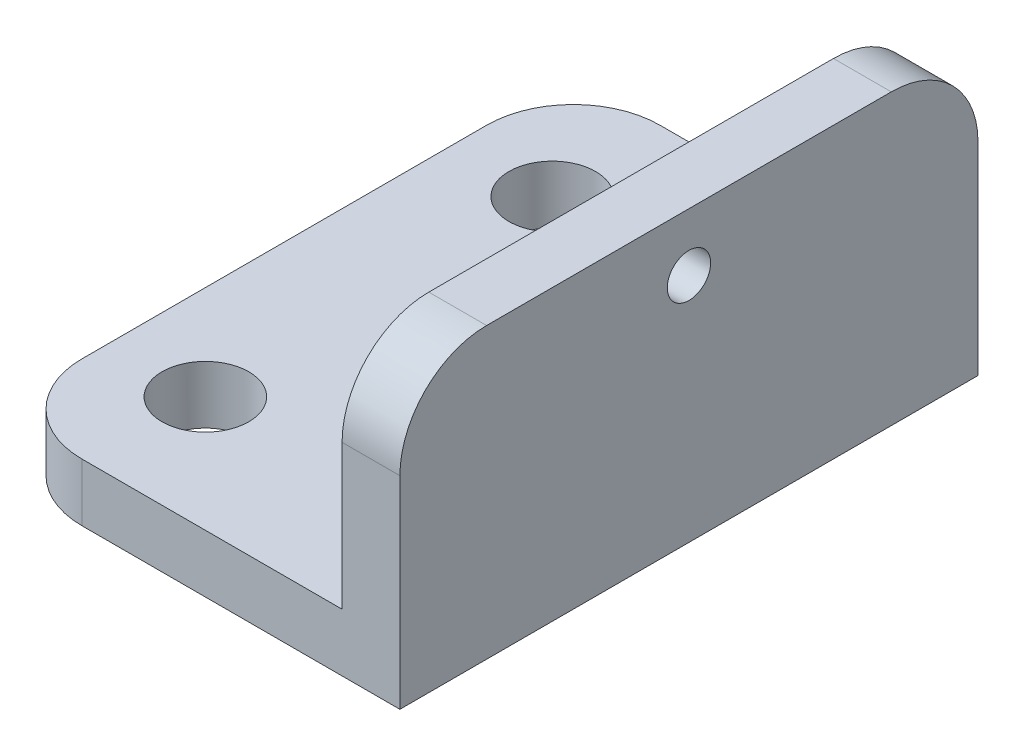
ISO-10303-21;
HEADER;
FILE_DESCRIPTION(('STEP AP214'),'2;1');
FILE_NAME('part.step','',(''),(''),'','','');
FILE_SCHEMA(('AUTOMOTIVE_DESIGN { 1 0 10303 214 1 1 1 1 }'));
ENDSEC;
DATA;
#1=APPLICATION_CONTEXT('core data for automotive mechanical design processes');
#2=APPLICATION_PROTOCOL_DEFINITION('international standard','automotive_design',2000,#1);
#3=PRODUCT_CONTEXT('',#1,'mechanical');
#4=PRODUCT('Part','Part','',(#3));
#5=PRODUCT_RELATED_PRODUCT_CATEGORY('part','',(#4));
#6=PRODUCT_DEFINITION_FORMATION('','',#4);
#7=PRODUCT_DEFINITION_CONTEXT('part definition',#1,'design');
#8=PRODUCT_DEFINITION('design','',#6,#7);
#9=PRODUCT_DEFINITION_SHAPE('','',#8);
#10=(LENGTH_UNIT() NAMED_UNIT(*) SI_UNIT(.MILLI.,.METRE.));
#11=(NAMED_UNIT(*) PLANE_ANGLE_UNIT() SI_UNIT($,.RADIAN.));
#12=(NAMED_UNIT(*) SI_UNIT($,.STERADIAN.) SOLID_ANGLE_UNIT());
#13=UNCERTAINTY_MEASURE_WITH_UNIT(LENGTH_MEASURE(1.E-05),#10,'distance_accuracy_value','');
#14=(GEOMETRIC_REPRESENTATION_CONTEXT(3) GLOBAL_UNCERTAINTY_ASSIGNED_CONTEXT((#13)) GLOBAL_UNIT_ASSIGNED_CONTEXT((#10,
#11,#12)) REPRESENTATION_CONTEXT('',''));
#15=CARTESIAN_POINT('',(0.,0.,0.));
#16=DIRECTION('',(0.,0.,1.));
#17=DIRECTION('',(1.,0.,0.));
#18=AXIS2_PLACEMENT_3D('',#15,#16,#17);
#19=CARTESIAN_POINT('',(2.,0.,10.));
#20=DIRECTION('',(-1.,0.,0.));
#21=DIRECTION('',(0.,0.,1.));
#22=AXIS2_PLACEMENT_3D('',#19,#20,#21);
#23=PLANE('',#22);
#24=CARTESIAN_POINT('',(2.,6.,0.));
#25=DIRECTION('',(-1.,0.,0.));
#26=DIRECTION('',(0.,0.,1.));
#27=AXIS2_PLACEMENT_3D('',#24,#25,#26);
#28=CIRCLE('',#27,0.75);
#29=CARTESIAN_POINT('',(2.,6.,0.75));
#30=VERTEX_POINT('',#29);
#31=EDGE_CURVE('E204',#30,#30,#28,.T.);
#32=ORIENTED_EDGE('',*,*,#31,.T.);
#33=EDGE_LOOP('',(#32));
#34=FACE_BOUND('',#33,.T.);
#35=DIRECTION('',(0.,0.,-1.));
#36=VECTOR('',#35,1.);
#37=CARTESIAN_POINT('',(2.,8.,10.));
#38=LINE('',#37,#36);
#39=CARTESIAN_POINT('',(2.,8.,7.));
#40=VERTEX_POINT('',#39);
#41=CARTESIAN_POINT('',(2.,8.,-7.));
#42=VERTEX_POINT('',#41);
#43=EDGE_CURVE('E160',#40,#42,#38,.T.);
#44=ORIENTED_EDGE('',*,*,#43,.F.);
#45=CARTESIAN_POINT('',(2.,5.,7.));
#46=DIRECTION('',(-1.,0.,0.));
#47=DIRECTION('',(0.,0.,1.));
#48=AXIS2_PLACEMENT_3D('',#45,#46,#47);
#49=CIRCLE('',#48,3.);
#50=CARTESIAN_POINT('',(2.,5.,10.));
#51=VERTEX_POINT('',#50);
#52=EDGE_CURVE('E170',#40,#51,#49,.F.);
#53=ORIENTED_EDGE('',*,*,#52,.T.);
#54=DIRECTION('',(0.,1.,0.));
#55=VECTOR('',#54,1.);
#56=CARTESIAN_POINT('',(2.,0.,10.));
#57=LINE('',#56,#55);
#58=CARTESIAN_POINT('',(2.,-2.,10.));
#59=VERTEX_POINT('',#58);
#60=EDGE_CURVE('E138',#59,#51,#57,.T.);
#61=ORIENTED_EDGE('',*,*,#60,.F.);
#62=DIRECTION('',(0.,0.,-1.));
#63=VECTOR('',#62,1.);
#64=CARTESIAN_POINT('',(2.,-2.,10.));
#65=LINE('',#64,#63);
#66=CARTESIAN_POINT('',(2.,-2.,-10.));
#67=VERTEX_POINT('',#66);
#68=EDGE_CURVE('E145',#59,#67,#65,.T.);
#69=ORIENTED_EDGE('',*,*,#68,.T.);
#70=DIRECTION('',(0.,1.,0.));
#71=VECTOR('',#70,1.);
#72=CARTESIAN_POINT('',(2.,0.,-10.));
#73=LINE('',#72,#71);
#74=CARTESIAN_POINT('',(2.,5.,-10.));
#75=VERTEX_POINT('',#74);
#76=EDGE_CURVE('E146',#67,#75,#73,.T.);
#77=ORIENTED_EDGE('',*,*,#76,.T.);
#78=CARTESIAN_POINT('',(2.,5.,-7.));
#79=DIRECTION('',(-1.,0.,0.));
#80=DIRECTION('',(0.,0.,1.));
#81=AXIS2_PLACEMENT_3D('',#78,#79,#80);
#82=CIRCLE('',#81,3.);
#83=EDGE_CURVE('E168',#75,#42,#82,.F.);
#84=ORIENTED_EDGE('',*,*,#83,.T.);
#85=EDGE_LOOP('',(#44,#53,#61,#69,#77,#84));
#86=FACE_BOUND('',#85,.T.);
#87=ADVANCED_FACE('F32',(#34,#86),#23,.F.);
#88=CARTESIAN_POINT('',(0.,8.,10.));
#89=DIRECTION('',(0.,1.,0.));
#90=DIRECTION('',(0.,0.,1.));
#91=AXIS2_PLACEMENT_3D('',#88,#89,#90);
#92=PLANE('',#91);
#93=DIRECTION('',(0.,0.,-1.));
#94=VECTOR('',#93,1.);
#95=CARTESIAN_POINT('',(0.,8.,10.));
#96=LINE('',#95,#94);
#97=CARTESIAN_POINT('',(0.,8.,7.));
#98=VERTEX_POINT('',#97);
#99=CARTESIAN_POINT('',(0.,8.,-7.));
#100=VERTEX_POINT('',#99);
#101=EDGE_CURVE('E131',#98,#100,#96,.T.);
#102=ORIENTED_EDGE('',*,*,#101,.F.);
#103=DIRECTION('',(1.,0.,0.));
#104=VECTOR('',#103,1.);
#105=CARTESIAN_POINT('',(2.,8.,7.));
#106=LINE('',#105,#104);
#107=EDGE_CURVE('E165',#98,#40,#106,.T.);
#108=ORIENTED_EDGE('',*,*,#107,.T.);
#109=ORIENTED_EDGE('',*,*,#43,.T.);
#110=DIRECTION('',(1.,0.,0.));
#111=VECTOR('',#110,1.);
#112=CARTESIAN_POINT('',(0.,8.,-7.));
#113=LINE('',#112,#111);
#114=EDGE_CURVE('E163',#42,#100,#113,.F.);
#115=ORIENTED_EDGE('',*,*,#114,.T.);
#116=EDGE_LOOP('',(#102,#108,#109,#115));
#117=FACE_BOUND('',#116,.T.);
#118=ADVANCED_FACE('F216',(#117),#92,.T.);
#119=CARTESIAN_POINT('',(0.,0.,10.));
#120=DIRECTION('',(-1.,0.,0.));
#121=DIRECTION('',(0.,0.,1.));
#122=AXIS2_PLACEMENT_3D('',#119,#120,#121);
#123=PLANE('',#122);
#124=CARTESIAN_POINT('',(0.,6.,0.));
#125=DIRECTION('',(-1.,0.,0.));
#126=DIRECTION('',(0.,0.,1.));
#127=AXIS2_PLACEMENT_3D('',#124,#125,#126);
#128=CIRCLE('',#127,0.75);
#129=CARTESIAN_POINT('',(0.,6.,0.75));
#130=VERTEX_POINT('',#129);
#131=EDGE_CURVE('E208',#130,#130,#128,.T.);
#132=ORIENTED_EDGE('',*,*,#131,.F.);
#133=EDGE_LOOP('',(#132));
#134=FACE_BOUND('',#133,.T.);
#135=DIRECTION('',(0.,1.,0.));
#136=VECTOR('',#135,1.);
#137=CARTESIAN_POINT('',(0.,0.,10.));
#138=LINE('',#137,#136);
#139=CARTESIAN_POINT('',(0.,0.,10.));
#140=VERTEX_POINT('',#139);
#141=CARTESIAN_POINT('',(0.,5.,10.));
#142=VERTEX_POINT('',#141);
#143=EDGE_CURVE('E123',#140,#142,#138,.T.);
#144=ORIENTED_EDGE('',*,*,#143,.T.);
#145=CARTESIAN_POINT('',(0.,5.,7.));
#146=DIRECTION('',(-1.,0.,0.));
#147=DIRECTION('',(0.,0.,1.));
#148=AXIS2_PLACEMENT_3D('',#145,#146,#147);
#149=CIRCLE('',#148,3.);
#150=EDGE_CURVE('E177',#142,#98,#149,.T.);
#151=ORIENTED_EDGE('',*,*,#150,.T.);
#152=ORIENTED_EDGE('',*,*,#101,.T.);
#153=CARTESIAN_POINT('',(0.,5.,-7.));
#154=DIRECTION('',(-1.,0.,0.));
#155=DIRECTION('',(0.,0.,1.));
#156=AXIS2_PLACEMENT_3D('',#153,#154,#155);
#157=CIRCLE('',#156,3.);
#158=CARTESIAN_POINT('',(0.,5.,-10.));
#159=VERTEX_POINT('',#158);
#160=EDGE_CURVE('E175',#100,#159,#157,.T.);
#161=ORIENTED_EDGE('',*,*,#160,.T.);
#162=DIRECTION('',(0.,1.,0.));
#163=VECTOR('',#162,1.);
#164=CARTESIAN_POINT('',(0.,0.,-10.));
#165=LINE('',#164,#163);
#166=CARTESIAN_POINT('',(0.,0.,-10.));
#167=VERTEX_POINT('',#166);
#168=EDGE_CURVE('E130',#167,#159,#165,.T.);
#169=ORIENTED_EDGE('',*,*,#168,.F.);
#170=DIRECTION('',(0.,0.,-1.));
#171=VECTOR('',#170,1.);
#172=CARTESIAN_POINT('',(0.,0.,10.));
#173=LINE('',#172,#171);
#174=EDGE_CURVE('E115',#140,#167,#173,.T.);
#175=ORIENTED_EDGE('',*,*,#174,.F.);
#176=EDGE_LOOP('',(#144,#151,#152,#161,#169,#175));
#177=FACE_BOUND('',#176,.T.);
#178=ADVANCED_FACE('F127',(#134,#177),#123,.T.);
#179=CARTESIAN_POINT('',(0.,0.,10.));
#180=DIRECTION('',(0.,1.,0.));
#181=DIRECTION('',(-1.,0.,0.));
#182=AXIS2_PLACEMENT_3D('',#179,#180,#181);
#183=PLANE('',#182);
#184=CARTESIAN_POINT('',(-8.729026118516,0.,-6.));
#185=DIRECTION('',(0.,1.,0.));
#186=DIRECTION('',(-1.,0.,0.));
#187=AXIS2_PLACEMENT_3D('',#184,#185,#186);
#188=CIRCLE('',#187,1.5);
#189=CARTESIAN_POINT('',(-10.229026118516,0.,-6.));
#190=VERTEX_POINT('',#189);
#191=EDGE_CURVE('E194',#190,#190,#188,.T.);
#192=ORIENTED_EDGE('',*,*,#191,.F.);
#193=EDGE_LOOP('',(#192));
#194=FACE_BOUND('',#193,.T.);
#195=CARTESIAN_POINT('',(-8.729026118516,0.,6.));
#196=DIRECTION('',(0.,1.,0.));
#197=DIRECTION('',(1.,0.,0.));
#198=AXIS2_PLACEMENT_3D('',#195,#196,#197);
#199=CIRCLE('',#198,1.5);
#200=CARTESIAN_POINT('',(-7.22902611851601,0.,6.));
#201=VERTEX_POINT('',#200);
#202=EDGE_CURVE('E199',#201,#201,#199,.T.);
#203=ORIENTED_EDGE('',*,*,#202,.F.);
#204=EDGE_LOOP('',(#203));
#205=FACE_BOUND('',#204,.T.);
#206=DIRECTION('',(1.,0.,0.));
#207=VECTOR('',#206,1.);
#208=CARTESIAN_POINT('',(0.,0.,-10.));
#209=LINE('',#208,#207);
#210=CARTESIAN_POINT('',(-9.,0.,-10.));
#211=VERTEX_POINT('',#210);
#212=EDGE_CURVE('E150',#211,#167,#209,.T.);
#213=ORIENTED_EDGE('',*,*,#212,.F.);
#214=CARTESIAN_POINT('',(-9.,0.,-7.));
#215=DIRECTION('',(0.,1.,0.));
#216=DIRECTION('',(-1.,0.,0.));
#217=AXIS2_PLACEMENT_3D('',#214,#215,#216);
#218=CIRCLE('',#217,3.);
#219=CARTESIAN_POINT('',(-12.,0.,-7.));
#220=VERTEX_POINT('',#219);
#221=EDGE_CURVE('E186',#211,#220,#218,.T.);
#222=ORIENTED_EDGE('',*,*,#221,.T.);
#223=DIRECTION('',(0.,0.,-1.));
#224=VECTOR('',#223,1.);
#225=CARTESIAN_POINT('',(-12.,0.,10.));
#226=LINE('',#225,#224);
#227=CARTESIAN_POINT('',(-12.,0.,7.));
#228=VERTEX_POINT('',#227);
#229=EDGE_CURVE('E132',#228,#220,#226,.T.);
#230=ORIENTED_EDGE('',*,*,#229,.F.);
#231=CARTESIAN_POINT('',(-9.,0.,7.));
#232=DIRECTION('',(0.,1.,0.));
#233=DIRECTION('',(-1.,0.,0.));
#234=AXIS2_PLACEMENT_3D('',#231,#232,#233);
#235=CIRCLE('',#234,3.);
#236=CARTESIAN_POINT('',(-9.,0.,10.));
#237=VERTEX_POINT('',#236);
#238=EDGE_CURVE('E118',#228,#237,#235,.T.);
#239=ORIENTED_EDGE('',*,*,#238,.T.);
#240=DIRECTION('',(1.,0.,0.));
#241=VECTOR('',#240,1.);
#242=CARTESIAN_POINT('',(0.,0.,10.));
#243=LINE('',#242,#241);
#244=EDGE_CURVE('E111',#237,#140,#243,.T.);
#245=ORIENTED_EDGE('',*,*,#244,.T.);
#246=ORIENTED_EDGE('',*,*,#174,.T.);
#247=EDGE_LOOP('',(#213,#222,#230,#239,#245,#246));
#248=FACE_BOUND('',#247,.T.);
#249=ADVANCED_FACE('F114',(#194,#205,#248),#183,.T.);
#250=CARTESIAN_POINT('',(-12.,-2.,10.));
#251=DIRECTION('',(-1.,0.,0.));
#252=DIRECTION('',(0.,0.,1.));
#253=AXIS2_PLACEMENT_3D('',#250,#251,#252);
#254=PLANE('',#253);
#255=ORIENTED_EDGE('',*,*,#229,.T.);
#256=DIRECTION('',(0.,1.,0.));
#257=VECTOR('',#256,1.);
#258=CARTESIAN_POINT('',(-12.,-2.,-7.));
#259=LINE('',#258,#257);
#260=CARTESIAN_POINT('',(-12.,-2.,-7.));
#261=VERTEX_POINT('',#260);
#262=EDGE_CURVE('E49',#220,#261,#259,.F.);
#263=ORIENTED_EDGE('',*,*,#262,.T.);
#264=DIRECTION('',(0.,0.,-1.));
#265=VECTOR('',#264,1.);
#266=CARTESIAN_POINT('',(-12.,-2.,10.));
#267=LINE('',#266,#265);
#268=CARTESIAN_POINT('',(-12.,-2.,7.));
#269=VERTEX_POINT('',#268);
#270=EDGE_CURVE('E155',#269,#261,#267,.T.);
#271=ORIENTED_EDGE('',*,*,#270,.F.);
#272=DIRECTION('',(0.,1.,0.));
#273=VECTOR('',#272,1.);
#274=CARTESIAN_POINT('',(-12.,0.,7.));
#275=LINE('',#274,#273);
#276=EDGE_CURVE('E188',#269,#228,#275,.T.);
#277=ORIENTED_EDGE('',*,*,#276,.T.);
#278=EDGE_LOOP('',(#255,#263,#271,#277));
#279=FACE_BOUND('',#278,.T.);
#280=ADVANCED_FACE('F222',(#279),#254,.T.);
#281=CARTESIAN_POINT('',(0.,-2.,10.));
#282=DIRECTION('',(0.,1.,0.));
#283=DIRECTION('',(-1.,0.,0.));
#284=AXIS2_PLACEMENT_3D('',#281,#282,#283);
#285=PLANE('',#284);
#286=CARTESIAN_POINT('',(-8.729026118516,-2.,-6.));
#287=DIRECTION('',(0.,1.,0.));
#288=DIRECTION('',(-1.,0.,0.));
#289=AXIS2_PLACEMENT_3D('',#286,#287,#288);
#290=CIRCLE('',#289,1.5);
#291=CARTESIAN_POINT('',(-10.229026118516,-2.,-6.));
#292=VERTEX_POINT('',#291);
#293=EDGE_CURVE('E36',#292,#292,#290,.T.);
#294=ORIENTED_EDGE('',*,*,#293,.T.);
#295=EDGE_LOOP('',(#294));
#296=FACE_BOUND('',#295,.T.);
#297=CARTESIAN_POINT('',(-8.729026118516,-2.,6.));
#298=DIRECTION('',(0.,1.,0.));
#299=DIRECTION('',(-1.,0.,0.));
#300=AXIS2_PLACEMENT_3D('',#297,#298,#299);
#301=CIRCLE('',#300,1.5);
#302=CARTESIAN_POINT('',(-10.229026118516,-2.,6.));
#303=VERTEX_POINT('',#302);
#304=EDGE_CURVE('E192',#303,#303,#301,.T.);
#305=ORIENTED_EDGE('',*,*,#304,.T.);
#306=EDGE_LOOP('',(#305));
#307=FACE_BOUND('',#306,.T.);
#308=ORIENTED_EDGE('',*,*,#270,.T.);
#309=CARTESIAN_POINT('',(-9.,-2.,-7.));
#310=DIRECTION('',(0.,1.,0.));
#311=DIRECTION('',(-1.,0.,0.));
#312=AXIS2_PLACEMENT_3D('',#309,#310,#311);
#313=CIRCLE('',#312,3.);
#314=CARTESIAN_POINT('',(-9.,-2.,-10.));
#315=VERTEX_POINT('',#314);
#316=EDGE_CURVE('E11',#261,#315,#313,.F.);
#317=ORIENTED_EDGE('',*,*,#316,.T.);
#318=DIRECTION('',(1.,0.,0.));
#319=VECTOR('',#318,1.);
#320=CARTESIAN_POINT('',(0.,-2.,-10.));
#321=LINE('',#320,#319);
#322=EDGE_CURVE('E140',#315,#67,#321,.T.);
#323=ORIENTED_EDGE('',*,*,#322,.T.);
#324=ORIENTED_EDGE('',*,*,#68,.F.);
#325=DIRECTION('',(1.,0.,0.));
#326=VECTOR('',#325,1.);
#327=CARTESIAN_POINT('',(0.,-2.,10.));
#328=LINE('',#327,#326);
#329=CARTESIAN_POINT('',(-9.,-2.,10.));
#330=VERTEX_POINT('',#329);
#331=EDGE_CURVE('E122',#330,#59,#328,.T.);
#332=ORIENTED_EDGE('',*,*,#331,.F.);
#333=CARTESIAN_POINT('',(-9.,-2.,7.));
#334=DIRECTION('',(0.,1.,0.));
#335=DIRECTION('',(-1.,0.,0.));
#336=AXIS2_PLACEMENT_3D('',#333,#334,#335);
#337=CIRCLE('',#336,3.);
#338=EDGE_CURVE('E41',#330,#269,#337,.F.);
#339=ORIENTED_EDGE('',*,*,#338,.T.);
#340=EDGE_LOOP('',(#308,#317,#323,#324,#332,#339));
#341=FACE_BOUND('',#340,.T.);
#342=ADVANCED_FACE('F253',(#296,#307,#341),#285,.F.);
#343=CARTESIAN_POINT('',(0.,0.,10.));
#344=DIRECTION('',(0.,0.,-1.));
#345=DIRECTION('',(-1.,0.,0.));
#346=AXIS2_PLACEMENT_3D('',#343,#344,#345);
#347=PLANE('',#346);
#348=ORIENTED_EDGE('',*,*,#60,.T.);
#349=DIRECTION('',(1.,0.,0.));
#350=VECTOR('',#349,1.);
#351=CARTESIAN_POINT('',(0.,5.,10.));
#352=LINE('',#351,#350);
#353=EDGE_CURVE('E137',#51,#142,#352,.F.);
#354=ORIENTED_EDGE('',*,*,#353,.T.);
#355=ORIENTED_EDGE('',*,*,#143,.F.);
#356=ORIENTED_EDGE('',*,*,#244,.F.);
#357=DIRECTION('',(0.,1.,0.));
#358=VECTOR('',#357,1.);
#359=CARTESIAN_POINT('',(-9.,-2.,10.));
#360=LINE('',#359,#358);
#361=EDGE_CURVE('E172',#237,#330,#360,.F.);
#362=ORIENTED_EDGE('',*,*,#361,.T.);
#363=ORIENTED_EDGE('',*,*,#331,.T.);
#364=EDGE_LOOP('',(#348,#354,#355,#356,#362,#363));
#365=FACE_BOUND('',#364,.T.);
#366=ADVANCED_FACE('F135',(#365),#347,.F.);
#367=CARTESIAN_POINT('',(0.,0.,-10.));
#368=DIRECTION('',(0.,0.,-1.));
#369=DIRECTION('',(-1.,0.,0.));
#370=AXIS2_PLACEMENT_3D('',#367,#368,#369);
#371=PLANE('',#370);
#372=ORIENTED_EDGE('',*,*,#168,.T.);
#373=DIRECTION('',(1.,0.,0.));
#374=VECTOR('',#373,1.);
#375=CARTESIAN_POINT('',(0.,5.,-10.));
#376=LINE('',#375,#374);
#377=EDGE_CURVE('E182',#159,#75,#376,.T.);
#378=ORIENTED_EDGE('',*,*,#377,.T.);
#379=ORIENTED_EDGE('',*,*,#76,.F.);
#380=ORIENTED_EDGE('',*,*,#322,.F.);
#381=DIRECTION('',(0.,1.,0.));
#382=VECTOR('',#381,1.);
#383=CARTESIAN_POINT('',(-9.,0.,-10.));
#384=LINE('',#383,#382);
#385=EDGE_CURVE('E179',#315,#211,#384,.T.);
#386=ORIENTED_EDGE('',*,*,#385,.T.);
#387=ORIENTED_EDGE('',*,*,#212,.T.);
#388=EDGE_LOOP('',(#372,#378,#379,#380,#386,#387));
#389=FACE_BOUND('',#388,.T.);
#390=ADVANCED_FACE('F238',(#389),#371,.T.);
#391=CARTESIAN_POINT('',(0.,5.,7.));
#392=DIRECTION('',(-1.,0.,0.));
#393=DIRECTION('',(0.,0.,1.));
#394=AXIS2_PLACEMENT_3D('',#391,#392,#393);
#395=CYLINDRICAL_SURFACE('',#394,3.);
#396=ORIENTED_EDGE('',*,*,#150,.F.);
#397=ORIENTED_EDGE('',*,*,#353,.F.);
#398=ORIENTED_EDGE('',*,*,#52,.F.);
#399=ORIENTED_EDGE('',*,*,#107,.F.);
#400=EDGE_LOOP('',(#396,#397,#398,#399));
#401=FACE_BOUND('',#400,.T.);
#402=ADVANCED_FACE('F234',(#401),#395,.T.);
#403=CARTESIAN_POINT('',(0.,5.,-7.));
#404=DIRECTION('',(1.,0.,0.));
#405=DIRECTION('',(0.,0.,-1.));
#406=AXIS2_PLACEMENT_3D('',#403,#404,#405);
#407=CYLINDRICAL_SURFACE('',#406,3.);
#408=ORIENTED_EDGE('',*,*,#160,.F.);
#409=ORIENTED_EDGE('',*,*,#114,.F.);
#410=ORIENTED_EDGE('',*,*,#83,.F.);
#411=ORIENTED_EDGE('',*,*,#377,.F.);
#412=EDGE_LOOP('',(#408,#409,#410,#411));
#413=FACE_BOUND('',#412,.T.);
#414=ADVANCED_FACE('F237',(#413),#407,.T.);
#415=CARTESIAN_POINT('',(-9.,0.,-7.));
#416=DIRECTION('',(0.,1.,0.));
#417=DIRECTION('',(0.,0.,1.));
#418=AXIS2_PLACEMENT_3D('',#415,#416,#417);
#419=CYLINDRICAL_SURFACE('',#418,3.);
#420=ORIENTED_EDGE('',*,*,#316,.F.);
#421=ORIENTED_EDGE('',*,*,#262,.F.);
#422=ORIENTED_EDGE('',*,*,#221,.F.);
#423=ORIENTED_EDGE('',*,*,#385,.F.);
#424=EDGE_LOOP('',(#420,#421,#422,#423));
#425=FACE_BOUND('',#424,.T.);
#426=ADVANCED_FACE('F241',(#425),#419,.T.);
#427=CARTESIAN_POINT('',(-9.,-2.,7.));
#428=DIRECTION('',(0.,-1.,0.));
#429=DIRECTION('',(0.,0.,-1.));
#430=AXIS2_PLACEMENT_3D('',#427,#428,#429);
#431=CYLINDRICAL_SURFACE('',#430,3.);
#432=ORIENTED_EDGE('',*,*,#338,.F.);
#433=ORIENTED_EDGE('',*,*,#361,.F.);
#434=ORIENTED_EDGE('',*,*,#238,.F.);
#435=ORIENTED_EDGE('',*,*,#276,.F.);
#436=EDGE_LOOP('',(#432,#433,#434,#435));
#437=FACE_BOUND('',#436,.T.);
#438=ADVANCED_FACE('F34',(#437),#431,.T.);
#439=CARTESIAN_POINT('',(-8.729026118516,-10.,6.));
#440=DIRECTION('',(0.,1.,0.));
#441=DIRECTION('',(-1.,0.,0.));
#442=AXIS2_PLACEMENT_3D('',#439,#440,#441);
#443=CYLINDRICAL_SURFACE('',#442,1.5);
#444=ORIENTED_EDGE('',*,*,#202,.T.);
#445=EDGE_LOOP('',(#444));
#446=FACE_BOUND('',#445,.T.);
#447=ORIENTED_EDGE('',*,*,#304,.F.);
#448=EDGE_LOOP('',(#447));
#449=FACE_BOUND('',#448,.T.);
#450=ADVANCED_FACE('F248',(#446,#449),#443,.F.);
#451=CARTESIAN_POINT('',(-8.729026118516,-10.,-6.));
#452=DIRECTION('',(0.,1.,0.));
#453=DIRECTION('',(-1.,0.,0.));
#454=AXIS2_PLACEMENT_3D('',#451,#452,#453);
#455=CYLINDRICAL_SURFACE('',#454,1.5);
#456=ORIENTED_EDGE('',*,*,#191,.T.);
#457=EDGE_LOOP('',(#456));
#458=FACE_BOUND('',#457,.T.);
#459=ORIENTED_EDGE('',*,*,#293,.F.);
#460=EDGE_LOOP('',(#459));
#461=FACE_BOUND('',#460,.T.);
#462=ADVANCED_FACE('F279',(#458,#461),#455,.F.);
#463=CARTESIAN_POINT('',(10.,6.,0.));
#464=DIRECTION('',(-1.,0.,0.));
#465=DIRECTION('',(0.,0.,1.));
#466=AXIS2_PLACEMENT_3D('',#463,#464,#465);
#467=CYLINDRICAL_SURFACE('',#466,0.75);
#468=ORIENTED_EDGE('',*,*,#131,.T.);
#469=EDGE_LOOP('',(#468));
#470=FACE_BOUND('',#469,.T.);
#471=ORIENTED_EDGE('',*,*,#31,.F.);
#472=EDGE_LOOP('',(#471));
#473=FACE_BOUND('',#472,.T.);
#474=ADVANCED_FACE('F212',(#470,#473),#467,.F.);
#475=CLOSED_SHELL('',(#87,#118,#178,#249,#280,#342,#366,#390,#402,#414,#426,#438,#450,#462,#474));
#476=MANIFOLD_SOLID_BREP('B2',#475);
#477=ADVANCED_BREP_SHAPE_REPRESENTATION('',(#18,#476),#14);
#478=SHAPE_DEFINITION_REPRESENTATION(#9,#477);
ENDSEC;
END-ISO-10303-21;
